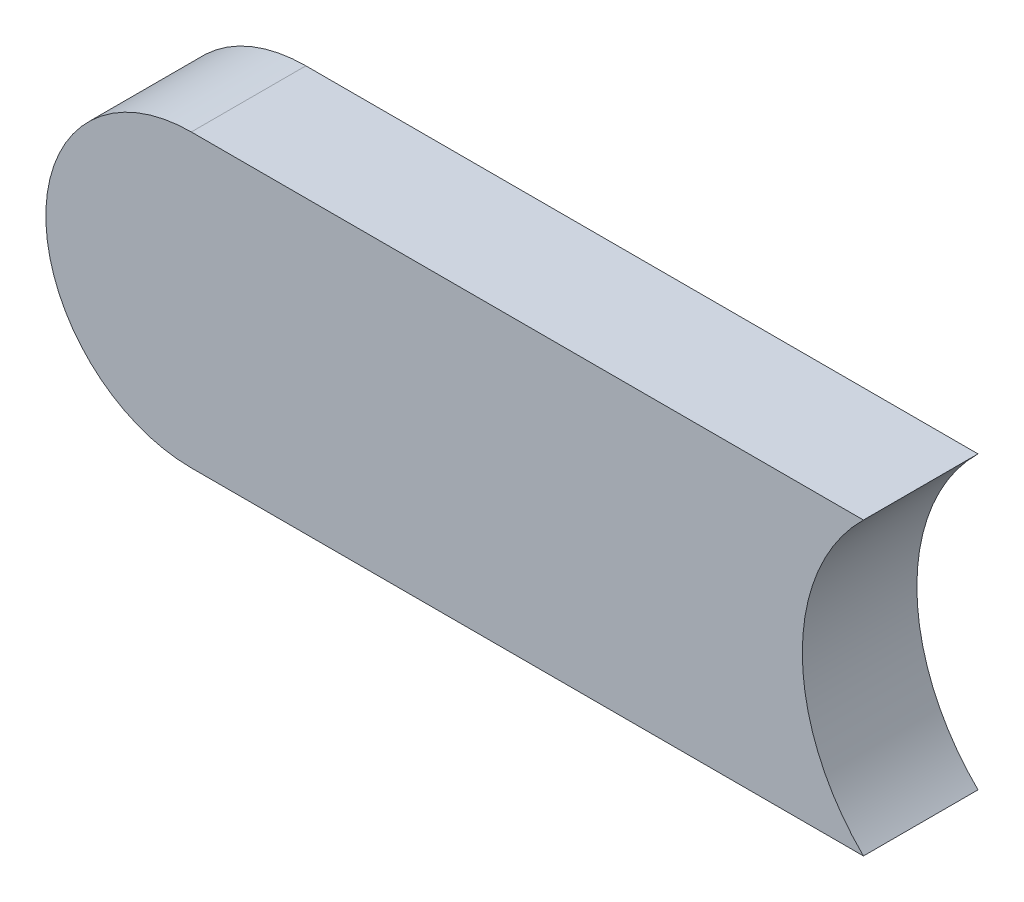
ISO-10303-21;
HEADER;
FILE_DESCRIPTION(('STEP AP214'),'2;1');
FILE_NAME('part.step','',(''),(''),'','','');
FILE_SCHEMA(('AUTOMOTIVE_DESIGN { 1 0 10303 214 1 1 1 1 }'));
ENDSEC;
DATA;
#1=APPLICATION_CONTEXT('core data for automotive mechanical design processes');
#2=APPLICATION_PROTOCOL_DEFINITION('international standard','automotive_design',2000,#1);
#3=PRODUCT_CONTEXT('',#1,'mechanical');
#4=PRODUCT('Part','Part','',(#3));
#5=PRODUCT_RELATED_PRODUCT_CATEGORY('part','',(#4));
#6=PRODUCT_DEFINITION_FORMATION('','',#4);
#7=PRODUCT_DEFINITION_CONTEXT('part definition',#1,'design');
#8=PRODUCT_DEFINITION('design','',#6,#7);
#9=PRODUCT_DEFINITION_SHAPE('','',#8);
#10=(LENGTH_UNIT() NAMED_UNIT(*) SI_UNIT(.MILLI.,.METRE.));
#11=(NAMED_UNIT(*) PLANE_ANGLE_UNIT() SI_UNIT($,.RADIAN.));
#12=(NAMED_UNIT(*) SI_UNIT($,.STERADIAN.) SOLID_ANGLE_UNIT());
#13=UNCERTAINTY_MEASURE_WITH_UNIT(LENGTH_MEASURE(1.E-05),#10,'distance_accuracy_value','');
#14=(GEOMETRIC_REPRESENTATION_CONTEXT(3) GLOBAL_UNCERTAINTY_ASSIGNED_CONTEXT((#13)) GLOBAL_UNIT_ASSIGNED_CONTEXT((#10,
#11,#12)) REPRESENTATION_CONTEXT('',''));
#15=CARTESIAN_POINT('',(0.,0.,0.));
#16=DIRECTION('',(0.,0.,1.));
#17=DIRECTION('',(1.,0.,0.));
#18=AXIS2_PLACEMENT_3D('',#15,#16,#17);
#19=CARTESIAN_POINT('',(136.2456,122.555,0.));
#20=DIRECTION('',(0.,1.,0.));
#21=DIRECTION('',(1.,0.,0.));
#22=AXIS2_PLACEMENT_3D('',#19,#20,#21);
#23=PLANE('',#22);
#24=DIRECTION('',(1.,0.,0.));
#25=VECTOR('',#24,1.);
#26=CARTESIAN_POINT('',(136.2456,122.555,0.1999996));
#27=LINE('',#26,#25);
#28=CARTESIAN_POINT('',(136.2456,122.555,0.1999996));
#29=VERTEX_POINT('',#28);
#30=CARTESIAN_POINT('',(137.419131842133,122.555,0.1999996));
#31=VERTEX_POINT('',#30);
#32=EDGE_CURVE('E11',#29,#31,#27,.T.);
#33=ORIENTED_EDGE('',*,*,#32,.F.);
#34=DIRECTION('',(0.,0.,1.));
#35=VECTOR('',#34,1.);
#36=CARTESIAN_POINT('',(136.2456,122.555,0.));
#37=LINE('',#36,#35);
#38=CARTESIAN_POINT('',(136.2456,122.555,0.));
#39=VERTEX_POINT('',#38);
#40=EDGE_CURVE('E24',#39,#29,#37,.T.);
#41=ORIENTED_EDGE('',*,*,#40,.F.);
#42=DIRECTION('',(1.,0.,0.));
#43=VECTOR('',#42,1.);
#44=CARTESIAN_POINT('',(136.2456,122.555,0.));
#45=LINE('',#44,#43);
#46=CARTESIAN_POINT('',(137.419131842133,122.555,0.));
#47=VERTEX_POINT('',#46);
#48=EDGE_CURVE('E75',#39,#47,#45,.T.);
#49=ORIENTED_EDGE('',*,*,#48,.T.);
#50=DIRECTION('',(0.,0.,1.));
#51=VECTOR('',#50,1.);
#52=CARTESIAN_POINT('',(137.419131842133,122.555,0.));
#53=LINE('',#52,#51);
#54=EDGE_CURVE('E37',#47,#31,#53,.T.);
#55=ORIENTED_EDGE('',*,*,#54,.T.);
#56=EDGE_LOOP('',(#33,#41,#49,#55));
#57=FACE_BOUND('',#56,.T.);
#58=ADVANCED_FACE('F17',(#57),#23,.F.);
#59=CARTESIAN_POINT('',(137.668,122.809,0.));
#60=DIRECTION('',(0.,0.,-1.));
#61=DIRECTION('',(1.,0.,0.));
#62=AXIS2_PLACEMENT_3D('',#59,#60,#61);
#63=CYLINDRICAL_SURFACE('',#62,0.3556);
#64=DIRECTION('',(0.,0.,1.));
#65=VECTOR('',#64,1.);
#66=CARTESIAN_POINT('',(137.419131842133,123.063,0.));
#67=LINE('',#66,#65);
#68=CARTESIAN_POINT('',(137.419131842133,123.063,0.));
#69=VERTEX_POINT('',#68);
#70=CARTESIAN_POINT('',(137.419131842133,123.063,0.1999996));
#71=VERTEX_POINT('',#70);
#72=EDGE_CURVE('E67',#69,#71,#67,.T.);
#73=ORIENTED_EDGE('',*,*,#72,.T.);
#74=CARTESIAN_POINT('',(137.668,122.809,0.1999996));
#75=DIRECTION('',(0.,0.,1.));
#76=DIRECTION('',(1.,0.,0.));
#77=AXIS2_PLACEMENT_3D('',#74,#75,#76);
#78=CIRCLE('',#77,0.3556);
#79=EDGE_CURVE('E82',#71,#31,#78,.T.);
#80=ORIENTED_EDGE('',*,*,#79,.T.);
#81=ORIENTED_EDGE('',*,*,#54,.F.);
#82=CARTESIAN_POINT('',(137.668,122.809,0.));
#83=DIRECTION('',(0.,0.,1.));
#84=DIRECTION('',(1.,0.,0.));
#85=AXIS2_PLACEMENT_3D('',#82,#83,#84);
#86=CIRCLE('',#85,0.3556);
#87=EDGE_CURVE('E80',#69,#47,#86,.T.);
#88=ORIENTED_EDGE('',*,*,#87,.F.);
#89=EDGE_LOOP('',(#73,#80,#81,#88));
#90=FACE_BOUND('',#89,.T.);
#91=ADVANCED_FACE('F88',(#90),#63,.F.);
#92=CARTESIAN_POINT('',(137.419131842133,123.063,0.));
#93=DIRECTION('',(0.,-1.,0.));
#94=DIRECTION('',(-1.,0.,0.));
#95=AXIS2_PLACEMENT_3D('',#92,#93,#94);
#96=PLANE('',#95);
#97=DIRECTION('',(-1.,0.,0.));
#98=VECTOR('',#97,1.);
#99=CARTESIAN_POINT('',(137.668,123.063,0.1999996));
#100=LINE('',#99,#98);
#101=CARTESIAN_POINT('',(136.2456,123.063,0.1999996));
#102=VERTEX_POINT('',#101);
#103=EDGE_CURVE('E71',#71,#102,#100,.T.);
#104=ORIENTED_EDGE('',*,*,#103,.F.);
#105=ORIENTED_EDGE('',*,*,#72,.F.);
#106=DIRECTION('',(-1.,0.,0.));
#107=VECTOR('',#106,1.);
#108=CARTESIAN_POINT('',(137.668,123.063,0.));
#109=LINE('',#108,#107);
#110=CARTESIAN_POINT('',(136.2456,123.063,0.));
#111=VERTEX_POINT('',#110);
#112=EDGE_CURVE('E63',#69,#111,#109,.T.);
#113=ORIENTED_EDGE('',*,*,#112,.T.);
#114=DIRECTION('',(0.,0.,1.));
#115=VECTOR('',#114,1.);
#116=CARTESIAN_POINT('',(136.2456,123.063,0.));
#117=LINE('',#116,#115);
#118=EDGE_CURVE('E53',#111,#102,#117,.T.);
#119=ORIENTED_EDGE('',*,*,#118,.T.);
#120=EDGE_LOOP('',(#104,#105,#113,#119));
#121=FACE_BOUND('',#120,.T.);
#122=ADVANCED_FACE('F66',(#121),#96,.F.);
#123=CARTESIAN_POINT('',(136.2456,122.809,0.));
#124=DIRECTION('',(0.,0.,-1.));
#125=DIRECTION('',(-1.11896493820492E-13,1.,0.));
#126=AXIS2_PLACEMENT_3D('',#123,#124,#125);
#127=CYLINDRICAL_SURFACE('',#126,0.254000000000005);
#128=CARTESIAN_POINT('',(136.2456,122.809,0.1999996));
#129=DIRECTION('',(0.,0.,1.));
#130=DIRECTION('',(-1.11896493820492E-13,1.,0.));
#131=AXIS2_PLACEMENT_3D('',#128,#129,#130);
#132=CIRCLE('',#131,0.254000000000005);
#133=EDGE_CURVE('E59',#102,#29,#132,.T.);
#134=ORIENTED_EDGE('',*,*,#133,.F.);
#135=ORIENTED_EDGE('',*,*,#118,.F.);
#136=CARTESIAN_POINT('',(136.2456,122.809,0.));
#137=DIRECTION('',(0.,0.,1.));
#138=DIRECTION('',(-1.11896493820492E-13,1.,0.));
#139=AXIS2_PLACEMENT_3D('',#136,#137,#138);
#140=CIRCLE('',#139,0.254000000000005);
#141=EDGE_CURVE('E57',#111,#39,#140,.T.);
#142=ORIENTED_EDGE('',*,*,#141,.T.);
#143=ORIENTED_EDGE('',*,*,#40,.T.);
#144=EDGE_LOOP('',(#134,#135,#142,#143));
#145=FACE_BOUND('',#144,.T.);
#146=ADVANCED_FACE('F55',(#145),#127,.T.);
#147=CARTESIAN_POINT('',(136.2456,122.555,0.));
#148=DIRECTION('',(0.,0.,-1.));
#149=DIRECTION('',(-1.,0.,0.));
#150=AXIS2_PLACEMENT_3D('',#147,#148,#149);
#151=PLANE('',#150);
#152=ORIENTED_EDGE('',*,*,#48,.F.);
#153=ORIENTED_EDGE('',*,*,#141,.F.);
#154=ORIENTED_EDGE('',*,*,#112,.F.);
#155=ORIENTED_EDGE('',*,*,#87,.T.);
#156=EDGE_LOOP('',(#152,#153,#154,#155));
#157=FACE_BOUND('',#156,.T.);
#158=ADVANCED_FACE('F74',(#157),#151,.T.);
#159=CARTESIAN_POINT('',(136.2456,122.555,0.1999996));
#160=DIRECTION('',(0.,0.,-1.));
#161=DIRECTION('',(-1.,0.,0.));
#162=AXIS2_PLACEMENT_3D('',#159,#160,#161);
#163=PLANE('',#162);
#164=ORIENTED_EDGE('',*,*,#133,.T.);
#165=ORIENTED_EDGE('',*,*,#32,.T.);
#166=ORIENTED_EDGE('',*,*,#79,.F.);
#167=ORIENTED_EDGE('',*,*,#103,.T.);
#168=EDGE_LOOP('',(#164,#165,#166,#167));
#169=FACE_BOUND('',#168,.T.);
#170=ADVANCED_FACE('F91',(#169),#163,.F.);
#171=CLOSED_SHELL('',(#58,#91,#122,#146,#158,#170));
#172=MANIFOLD_SOLID_BREP('B1',#171);
#173=ADVANCED_BREP_SHAPE_REPRESENTATION('',(#18,#172),#14);
#174=SHAPE_DEFINITION_REPRESENTATION(#9,#173);
ENDSEC;
END-ISO-10303-21;
